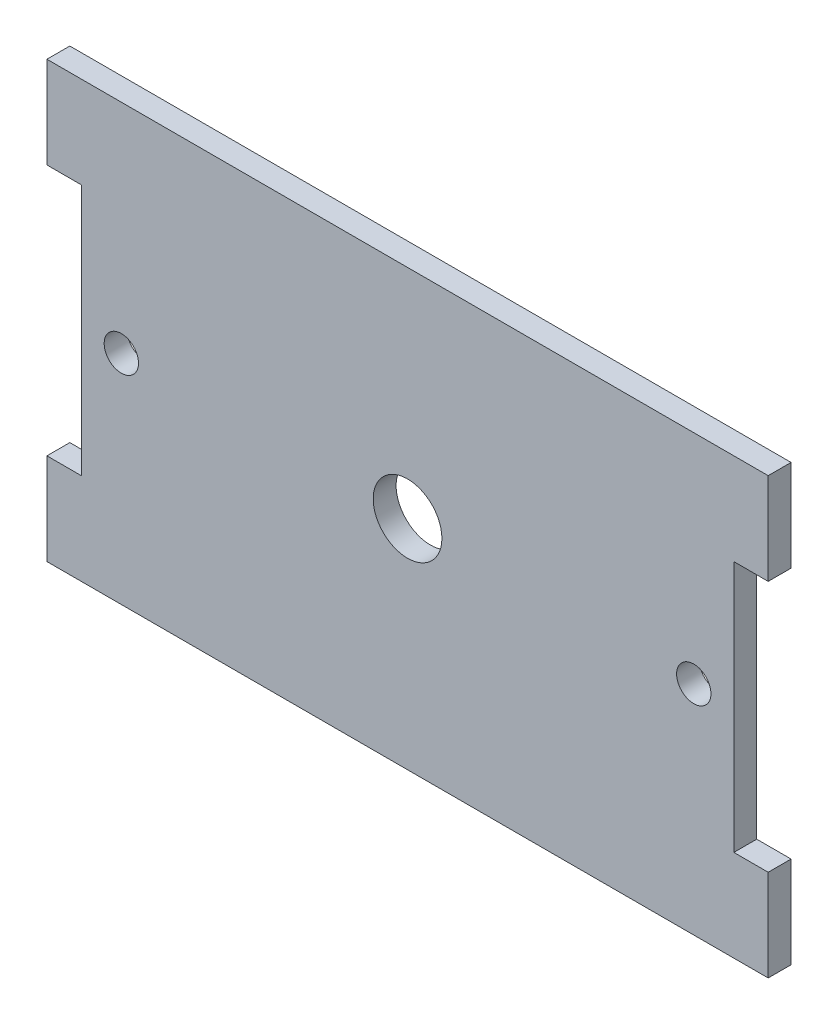
ISO-10303-21;
HEADER;
FILE_DESCRIPTION(('STEP AP214'),'2;1');
FILE_NAME('part.step','',(''),(''),'','','');
FILE_SCHEMA(('AUTOMOTIVE_DESIGN { 1 0 10303 214 1 1 1 1 }'));
ENDSEC;
DATA;
#1=APPLICATION_CONTEXT('core data for automotive mechanical design processes');
#2=APPLICATION_PROTOCOL_DEFINITION('international standard','automotive_design',2000,#1);
#3=PRODUCT_CONTEXT('',#1,'mechanical');
#4=PRODUCT('Part','Part','',(#3));
#5=PRODUCT_RELATED_PRODUCT_CATEGORY('part','',(#4));
#6=PRODUCT_DEFINITION_FORMATION('','',#4);
#7=PRODUCT_DEFINITION_CONTEXT('part definition',#1,'design');
#8=PRODUCT_DEFINITION('design','',#6,#7);
#9=PRODUCT_DEFINITION_SHAPE('','',#8);
#10=(LENGTH_UNIT() NAMED_UNIT(*) SI_UNIT(.MILLI.,.METRE.));
#11=(NAMED_UNIT(*) PLANE_ANGLE_UNIT() SI_UNIT($,.RADIAN.));
#12=(NAMED_UNIT(*) SI_UNIT($,.STERADIAN.) SOLID_ANGLE_UNIT());
#13=UNCERTAINTY_MEASURE_WITH_UNIT(LENGTH_MEASURE(1.E-05),#10,'distance_accuracy_value','');
#14=(GEOMETRIC_REPRESENTATION_CONTEXT(3) GLOBAL_UNCERTAINTY_ASSIGNED_CONTEXT((#13)) GLOBAL_UNIT_ASSIGNED_CONTEXT((#10,
#11,#12)) REPRESENTATION_CONTEXT('',''));
#15=CARTESIAN_POINT('',(0.,0.,0.));
#16=DIRECTION('',(0.,0.,1.));
#17=DIRECTION('',(1.,0.,0.));
#18=AXIS2_PLACEMENT_3D('',#15,#16,#17);
#19=CARTESIAN_POINT('',(0.,0.,2.));
#20=DIRECTION('',(0.,0.,1.));
#21=DIRECTION('',(1.,0.,0.));
#22=AXIS2_PLACEMENT_3D('',#19,#20,#21);
#23=PLANE('',#22);
#24=CARTESIAN_POINT('',(40.241142957594,-61.8725999131917,2.));
#25=DIRECTION('',(0.,0.,1.));
#26=DIRECTION('',(1.,0.,0.));
#27=AXIS2_PLACEMENT_3D('',#24,#25,#26);
#28=CIRCLE('',#27,1.5);
#29=CARTESIAN_POINT('',(41.7411429575941,-61.8725999131917,2.));
#30=VERTEX_POINT('',#29);
#31=EDGE_CURVE('E251',#30,#30,#28,.T.);
#32=ORIENTED_EDGE('',*,*,#31,.F.);
#33=EDGE_LOOP('',(#32));
#34=FACE_BOUND('',#33,.T.);
#35=DIRECTION('',(0.,-1.,0.));
#36=VECTOR('',#35,1.);
#37=CARTESIAN_POINT('',(-16.258857042406,-42.8725999131917,2.));
#38=LINE('',#37,#36);
#39=CARTESIAN_POINT('',(-16.258857042406,-42.8725999131917,2.));
#40=VERTEX_POINT('',#39);
#41=CARTESIAN_POINT('',(-16.258857042406,-50.8725999131917,2.));
#42=VERTEX_POINT('',#41);
#43=EDGE_CURVE('E179',#40,#42,#38,.T.);
#44=ORIENTED_EDGE('',*,*,#43,.T.);
#45=DIRECTION('',(1.,0.,0.));
#46=VECTOR('',#45,1.);
#47=CARTESIAN_POINT('',(-16.258857042406,-50.8725999131917,2.));
#48=LINE('',#47,#46);
#49=CARTESIAN_POINT('',(-13.258857042406,-50.8725999131917,2.));
#50=VERTEX_POINT('',#49);
#51=EDGE_CURVE('E102',#42,#50,#48,.T.);
#52=ORIENTED_EDGE('',*,*,#51,.T.);
#53=DIRECTION('',(0.,-1.,0.));
#54=VECTOR('',#53,1.);
#55=CARTESIAN_POINT('',(-13.258857042406,-72.8725999131917,2.));
#56=LINE('',#55,#54);
#57=CARTESIAN_POINT('',(-13.258857042406,-72.8725999131917,2.));
#58=VERTEX_POINT('',#57);
#59=EDGE_CURVE('E206',#50,#58,#56,.T.);
#60=ORIENTED_EDGE('',*,*,#59,.T.);
#61=DIRECTION('',(-1.,0.,0.));
#62=VECTOR('',#61,1.);
#63=CARTESIAN_POINT('',(-16.258857042406,-72.8725999131917,2.));
#64=LINE('',#63,#62);
#65=CARTESIAN_POINT('',(-16.258857042406,-72.8725999131917,2.));
#66=VERTEX_POINT('',#65);
#67=EDGE_CURVE('E222',#58,#66,#64,.T.);
#68=ORIENTED_EDGE('',*,*,#67,.T.);
#69=DIRECTION('',(0.,-1.,0.));
#70=VECTOR('',#69,1.);
#71=CARTESIAN_POINT('',(-16.258857042406,-80.8725999131917,2.));
#72=LINE('',#71,#70);
#73=CARTESIAN_POINT('',(-16.258857042406,-80.8725999131917,2.));
#74=VERTEX_POINT('',#73);
#75=EDGE_CURVE('E219',#66,#74,#72,.T.);
#76=ORIENTED_EDGE('',*,*,#75,.T.);
#77=DIRECTION('',(1.,0.,0.));
#78=VECTOR('',#77,1.);
#79=CARTESIAN_POINT('',(-13.258857042406,-80.8725999131917,2.));
#80=LINE('',#79,#78);
#81=CARTESIAN_POINT('',(46.741142957594,-80.8725999131917,2.));
#82=VERTEX_POINT('',#81);
#83=EDGE_CURVE('E221',#74,#82,#80,.T.);
#84=ORIENTED_EDGE('',*,*,#83,.T.);
#85=DIRECTION('',(0.,1.,0.));
#86=VECTOR('',#85,1.);
#87=CARTESIAN_POINT('',(46.741142957594,-80.8725999131917,2.));
#88=LINE('',#87,#86);
#89=CARTESIAN_POINT('',(46.741142957594,-72.8725999131917,2.));
#90=VERTEX_POINT('',#89);
#91=EDGE_CURVE('E224',#82,#90,#88,.T.);
#92=ORIENTED_EDGE('',*,*,#91,.T.);
#93=DIRECTION('',(-1.,0.,0.));
#94=VECTOR('',#93,1.);
#95=CARTESIAN_POINT('',(46.741142957594,-72.8725999131917,2.));
#96=LINE('',#95,#94);
#97=CARTESIAN_POINT('',(43.741142957594,-72.8725999131917,2.));
#98=VERTEX_POINT('',#97);
#99=EDGE_CURVE('E230',#90,#98,#96,.T.);
#100=ORIENTED_EDGE('',*,*,#99,.T.);
#101=DIRECTION('',(0.,1.,0.));
#102=VECTOR('',#101,1.);
#103=CARTESIAN_POINT('',(43.741142957594,-72.8725999131917,2.));
#104=LINE('',#103,#102);
#105=CARTESIAN_POINT('',(43.741142957594,-50.8725999131917,2.));
#106=VERTEX_POINT('',#105);
#107=EDGE_CURVE('E134',#98,#106,#104,.T.);
#108=ORIENTED_EDGE('',*,*,#107,.T.);
#109=DIRECTION('',(1.,0.,0.));
#110=VECTOR('',#109,1.);
#111=CARTESIAN_POINT('',(46.741142957594,-50.8725999131917,2.));
#112=LINE('',#111,#110);
#113=CARTESIAN_POINT('',(46.741142957594,-50.8725999131917,2.));
#114=VERTEX_POINT('',#113);
#115=EDGE_CURVE('E127',#106,#114,#112,.T.);
#116=ORIENTED_EDGE('',*,*,#115,.T.);
#117=DIRECTION('',(0.,1.,0.));
#118=VECTOR('',#117,1.);
#119=CARTESIAN_POINT('',(46.741142957594,-42.8725999131917,2.));
#120=LINE('',#119,#118);
#121=CARTESIAN_POINT('',(46.741142957594,-42.8725999131917,2.));
#122=VERTEX_POINT('',#121);
#123=EDGE_CURVE('E131',#114,#122,#120,.T.);
#124=ORIENTED_EDGE('',*,*,#123,.T.);
#125=DIRECTION('',(-1.,0.,0.));
#126=VECTOR('',#125,1.);
#127=CARTESIAN_POINT('',(43.741142957594,-42.8725999131917,2.));
#128=LINE('',#127,#126);
#129=EDGE_CURVE('E49',#122,#40,#128,.T.);
#130=ORIENTED_EDGE('',*,*,#129,.T.);
#131=EDGE_LOOP('',(#44,#52,#60,#68,#76,#84,#92,#100,#108,#116,#124,#130));
#132=FACE_BOUND('',#131,.T.);
#133=CARTESIAN_POINT('',(15.241142957594,-61.8725999131917,2.));
#134=DIRECTION('',(0.,0.,1.));
#135=DIRECTION('',(1.,0.,0.));
#136=AXIS2_PLACEMENT_3D('',#133,#134,#135);
#137=CIRCLE('',#136,3.);
#138=CARTESIAN_POINT('',(18.241142957594,-61.8725999131917,2.));
#139=VERTEX_POINT('',#138);
#140=EDGE_CURVE('E158',#139,#139,#137,.T.);
#141=ORIENTED_EDGE('',*,*,#140,.F.);
#142=EDGE_LOOP('',(#141));
#143=FACE_BOUND('',#142,.T.);
#144=CARTESIAN_POINT('',(-9.75885704240595,-61.8725999131917,2.));
#145=DIRECTION('',(0.,0.,1.));
#146=DIRECTION('',(-1.,0.,0.));
#147=AXIS2_PLACEMENT_3D('',#144,#145,#146);
#148=CIRCLE('',#147,1.5);
#149=CARTESIAN_POINT('',(-11.258857042406,-61.8725999131917,2.));
#150=VERTEX_POINT('',#149);
#151=EDGE_CURVE('E257',#150,#150,#148,.T.);
#152=ORIENTED_EDGE('',*,*,#151,.F.);
#153=EDGE_LOOP('',(#152));
#154=FACE_BOUND('',#153,.T.);
#155=ADVANCED_FACE('F32',(#34,#132,#143,#154),#23,.T.);
#156=CARTESIAN_POINT('',(0.,0.,0.));
#157=DIRECTION('',(0.,0.,1.));
#158=DIRECTION('',(1.,0.,0.));
#159=AXIS2_PLACEMENT_3D('',#156,#157,#158);
#160=PLANE('',#159);
#161=DIRECTION('',(0.,-1.,0.));
#162=VECTOR('',#161,1.);
#163=CARTESIAN_POINT('',(-16.258857042406,-42.8725999131917,0.));
#164=LINE('',#163,#162);
#165=CARTESIAN_POINT('',(-16.258857042406,-42.8725999131917,0.));
#166=VERTEX_POINT('',#165);
#167=CARTESIAN_POINT('',(-16.258857042406,-50.8725999131917,0.));
#168=VERTEX_POINT('',#167);
#169=EDGE_CURVE('E154',#166,#168,#164,.T.);
#170=ORIENTED_EDGE('',*,*,#169,.F.);
#171=DIRECTION('',(-1.,0.,0.));
#172=VECTOR('',#171,1.);
#173=CARTESIAN_POINT('',(-13.258857042406,-42.8725999131917,0.));
#174=LINE('',#173,#172);
#175=CARTESIAN_POINT('',(46.741142957594,-42.8725999131917,0.));
#176=VERTEX_POINT('',#175);
#177=EDGE_CURVE('E90',#176,#166,#174,.T.);
#178=ORIENTED_EDGE('',*,*,#177,.F.);
#179=DIRECTION('',(0.,1.,0.));
#180=VECTOR('',#179,1.);
#181=CARTESIAN_POINT('',(46.741142957594,-42.8725999131917,0.));
#182=LINE('',#181,#180);
#183=CARTESIAN_POINT('',(46.741142957594,-50.8725999131917,0.));
#184=VERTEX_POINT('',#183);
#185=EDGE_CURVE('E176',#184,#176,#182,.T.);
#186=ORIENTED_EDGE('',*,*,#185,.F.);
#187=DIRECTION('',(1.,0.,0.));
#188=VECTOR('',#187,1.);
#189=CARTESIAN_POINT('',(46.741142957594,-50.8725999131917,0.));
#190=LINE('',#189,#188);
#191=CARTESIAN_POINT('',(43.741142957594,-50.8725999131917,0.));
#192=VERTEX_POINT('',#191);
#193=EDGE_CURVE('E143',#192,#184,#190,.T.);
#194=ORIENTED_EDGE('',*,*,#193,.F.);
#195=DIRECTION('',(0.,1.,0.));
#196=VECTOR('',#195,1.);
#197=CARTESIAN_POINT('',(43.741142957594,-72.8725999131917,0.));
#198=LINE('',#197,#196);
#199=CARTESIAN_POINT('',(43.741142957594,-72.8725999131917,0.));
#200=VERTEX_POINT('',#199);
#201=EDGE_CURVE('E173',#200,#192,#198,.T.);
#202=ORIENTED_EDGE('',*,*,#201,.F.);
#203=DIRECTION('',(-1.,0.,0.));
#204=VECTOR('',#203,1.);
#205=CARTESIAN_POINT('',(46.741142957594,-72.8725999131917,0.));
#206=LINE('',#205,#204);
#207=CARTESIAN_POINT('',(46.741142957594,-72.8725999131917,0.));
#208=VERTEX_POINT('',#207);
#209=EDGE_CURVE('E171',#208,#200,#206,.T.);
#210=ORIENTED_EDGE('',*,*,#209,.F.);
#211=DIRECTION('',(0.,1.,0.));
#212=VECTOR('',#211,1.);
#213=CARTESIAN_POINT('',(46.741142957594,-80.8725999131917,0.));
#214=LINE('',#213,#212);
#215=CARTESIAN_POINT('',(46.741142957594,-80.8725999131917,0.));
#216=VERTEX_POINT('',#215);
#217=EDGE_CURVE('E169',#216,#208,#214,.T.);
#218=ORIENTED_EDGE('',*,*,#217,.F.);
#219=DIRECTION('',(1.,0.,0.));
#220=VECTOR('',#219,1.);
#221=CARTESIAN_POINT('',(43.741142957594,-80.8725999131917,0.));
#222=LINE('',#221,#220);
#223=CARTESIAN_POINT('',(-16.258857042406,-80.8725999131917,0.));
#224=VERTEX_POINT('',#223);
#225=EDGE_CURVE('E167',#224,#216,#222,.T.);
#226=ORIENTED_EDGE('',*,*,#225,.F.);
#227=DIRECTION('',(0.,-1.,0.));
#228=VECTOR('',#227,1.);
#229=CARTESIAN_POINT('',(-16.258857042406,-80.8725999131917,0.));
#230=LINE('',#229,#228);
#231=CARTESIAN_POINT('',(-16.258857042406,-72.8725999131917,0.));
#232=VERTEX_POINT('',#231);
#233=EDGE_CURVE('E164',#232,#224,#230,.T.);
#234=ORIENTED_EDGE('',*,*,#233,.F.);
#235=DIRECTION('',(-1.,0.,0.));
#236=VECTOR('',#235,1.);
#237=CARTESIAN_POINT('',(-16.258857042406,-72.8725999131917,0.));
#238=LINE('',#237,#236);
#239=CARTESIAN_POINT('',(-13.258857042406,-72.8725999131917,0.));
#240=VERTEX_POINT('',#239);
#241=EDGE_CURVE('E162',#240,#232,#238,.T.);
#242=ORIENTED_EDGE('',*,*,#241,.F.);
#243=DIRECTION('',(0.,-1.,0.));
#244=VECTOR('',#243,1.);
#245=CARTESIAN_POINT('',(-13.258857042406,-72.8725999131917,0.));
#246=LINE('',#245,#244);
#247=CARTESIAN_POINT('',(-13.258857042406,-50.8725999131917,0.));
#248=VERTEX_POINT('',#247);
#249=EDGE_CURVE('E160',#248,#240,#246,.T.);
#250=ORIENTED_EDGE('',*,*,#249,.F.);
#251=DIRECTION('',(1.,0.,0.));
#252=VECTOR('',#251,1.);
#253=CARTESIAN_POINT('',(-16.258857042406,-50.8725999131917,0.));
#254=LINE('',#253,#252);
#255=EDGE_CURVE('E157',#168,#248,#254,.T.);
#256=ORIENTED_EDGE('',*,*,#255,.F.);
#257=EDGE_LOOP('',(#170,#178,#186,#194,#202,#210,#218,#226,#234,#242,#250,#256));
#258=FACE_BOUND('',#257,.T.);
#259=CARTESIAN_POINT('',(15.241142957594,-61.8725999131917,0.));
#260=DIRECTION('',(0.,0.,1.));
#261=DIRECTION('',(1.,0.,0.));
#262=AXIS2_PLACEMENT_3D('',#259,#260,#261);
#263=CIRCLE('',#262,3.);
#264=CARTESIAN_POINT('',(18.241142957594,-61.8725999131917,0.));
#265=VERTEX_POINT('',#264);
#266=EDGE_CURVE('E248',#265,#265,#263,.T.);
#267=ORIENTED_EDGE('',*,*,#266,.T.);
#268=EDGE_LOOP('',(#267));
#269=FACE_BOUND('',#268,.T.);
#270=CARTESIAN_POINT('',(40.241142957594,-61.8725999131917,0.));
#271=DIRECTION('',(0.,0.,1.));
#272=DIRECTION('',(1.,0.,0.));
#273=AXIS2_PLACEMENT_3D('',#270,#271,#272);
#274=CIRCLE('',#273,1.5);
#275=CARTESIAN_POINT('',(41.7411429575941,-61.8725999131917,0.));
#276=VERTEX_POINT('',#275);
#277=EDGE_CURVE('E254',#276,#276,#274,.T.);
#278=ORIENTED_EDGE('',*,*,#277,.T.);
#279=EDGE_LOOP('',(#278));
#280=FACE_BOUND('',#279,.T.);
#281=CARTESIAN_POINT('',(-9.75885704240595,-61.8725999131917,0.));
#282=DIRECTION('',(0.,0.,1.));
#283=DIRECTION('',(-1.,0.,0.));
#284=AXIS2_PLACEMENT_3D('',#281,#282,#283);
#285=CIRCLE('',#284,1.5);
#286=CARTESIAN_POINT('',(-11.258857042406,-61.8725999131917,0.));
#287=VERTEX_POINT('',#286);
#288=EDGE_CURVE('E260',#287,#287,#285,.T.);
#289=ORIENTED_EDGE('',*,*,#288,.T.);
#290=EDGE_LOOP('',(#289));
#291=FACE_BOUND('',#290,.T.);
#292=ADVANCED_FACE('F208',(#258,#269,#280,#291),#160,.F.);
#293=CARTESIAN_POINT('',(-16.258857042406,-42.8725999131917,2.));
#294=DIRECTION('',(1.,0.,0.));
#295=DIRECTION('',(0.,0.,-1.));
#296=AXIS2_PLACEMENT_3D('',#293,#294,#295);
#297=PLANE('',#296);
#298=ORIENTED_EDGE('',*,*,#169,.T.);
#299=DIRECTION('',(0.,0.,-1.));
#300=VECTOR('',#299,1.);
#301=CARTESIAN_POINT('',(-16.258857042406,-50.8725999131917,2.));
#302=LINE('',#301,#300);
#303=EDGE_CURVE('E11',#42,#168,#302,.T.);
#304=ORIENTED_EDGE('',*,*,#303,.F.);
#305=ORIENTED_EDGE('',*,*,#43,.F.);
#306=DIRECTION('',(0.,0.,-1.));
#307=VECTOR('',#306,1.);
#308=CARTESIAN_POINT('',(-16.258857042406,-42.8725999131917,2.));
#309=LINE('',#308,#307);
#310=EDGE_CURVE('E150',#40,#166,#309,.T.);
#311=ORIENTED_EDGE('',*,*,#310,.T.);
#312=EDGE_LOOP('',(#298,#304,#305,#311));
#313=FACE_BOUND('',#312,.T.);
#314=ADVANCED_FACE('F34',(#313),#297,.F.);
#315=CARTESIAN_POINT('',(-16.258857042406,-50.8725999131917,2.));
#316=DIRECTION('',(0.,1.,0.));
#317=DIRECTION('',(0.,0.,1.));
#318=AXIS2_PLACEMENT_3D('',#315,#316,#317);
#319=PLANE('',#318);
#320=ORIENTED_EDGE('',*,*,#255,.T.);
#321=DIRECTION('',(0.,0.,-1.));
#322=VECTOR('',#321,1.);
#323=CARTESIAN_POINT('',(-13.258857042406,-50.8725999131917,2.));
#324=LINE('',#323,#322);
#325=EDGE_CURVE('E41',#50,#248,#324,.T.);
#326=ORIENTED_EDGE('',*,*,#325,.F.);
#327=ORIENTED_EDGE('',*,*,#51,.F.);
#328=ORIENTED_EDGE('',*,*,#303,.T.);
#329=EDGE_LOOP('',(#320,#326,#327,#328));
#330=FACE_BOUND('',#329,.T.);
#331=ADVANCED_FACE('F304',(#330),#319,.F.);
#332=CARTESIAN_POINT('',(-13.258857042406,-72.8725999131917,2.));
#333=DIRECTION('',(1.,0.,0.));
#334=DIRECTION('',(0.,1.,0.));
#335=AXIS2_PLACEMENT_3D('',#332,#333,#334);
#336=PLANE('',#335);
#337=ORIENTED_EDGE('',*,*,#249,.T.);
#338=DIRECTION('',(0.,0.,-1.));
#339=VECTOR('',#338,1.);
#340=CARTESIAN_POINT('',(-13.258857042406,-72.8725999131917,2.));
#341=LINE('',#340,#339);
#342=EDGE_CURVE('E198',#58,#240,#341,.T.);
#343=ORIENTED_EDGE('',*,*,#342,.F.);
#344=ORIENTED_EDGE('',*,*,#59,.F.);
#345=ORIENTED_EDGE('',*,*,#325,.T.);
#346=EDGE_LOOP('',(#337,#343,#344,#345));
#347=FACE_BOUND('',#346,.T.);
#348=ADVANCED_FACE('F204',(#347),#336,.F.);
#349=CARTESIAN_POINT('',(-16.258857042406,-72.8725999131917,2.));
#350=DIRECTION('',(0.,-1.,0.));
#351=DIRECTION('',(0.,0.,-1.));
#352=AXIS2_PLACEMENT_3D('',#349,#350,#351);
#353=PLANE('',#352);
#354=ORIENTED_EDGE('',*,*,#241,.T.);
#355=DIRECTION('',(0.,0.,-1.));
#356=VECTOR('',#355,1.);
#357=CARTESIAN_POINT('',(-16.258857042406,-72.8725999131917,2.));
#358=LINE('',#357,#356);
#359=EDGE_CURVE('E195',#66,#232,#358,.T.);
#360=ORIENTED_EDGE('',*,*,#359,.F.);
#361=ORIENTED_EDGE('',*,*,#67,.F.);
#362=ORIENTED_EDGE('',*,*,#342,.T.);
#363=EDGE_LOOP('',(#354,#360,#361,#362));
#364=FACE_BOUND('',#363,.T.);
#365=ADVANCED_FACE('F213',(#364),#353,.F.);
#366=CARTESIAN_POINT('',(-16.258857042406,-80.8725999131917,2.));
#367=DIRECTION('',(1.,0.,0.));
#368=DIRECTION('',(0.,0.,-1.));
#369=AXIS2_PLACEMENT_3D('',#366,#367,#368);
#370=PLANE('',#369);
#371=ORIENTED_EDGE('',*,*,#233,.T.);
#372=DIRECTION('',(0.,0.,-1.));
#373=VECTOR('',#372,1.);
#374=CARTESIAN_POINT('',(-16.258857042406,-80.8725999131917,2.));
#375=LINE('',#374,#373);
#376=EDGE_CURVE('E192',#74,#224,#375,.T.);
#377=ORIENTED_EDGE('',*,*,#376,.F.);
#378=ORIENTED_EDGE('',*,*,#75,.F.);
#379=ORIENTED_EDGE('',*,*,#359,.T.);
#380=EDGE_LOOP('',(#371,#377,#378,#379));
#381=FACE_BOUND('',#380,.T.);
#382=ADVANCED_FACE('F217',(#381),#370,.F.);
#383=CARTESIAN_POINT('',(43.741142957594,-80.8725999131917,2.));
#384=DIRECTION('',(0.,1.,0.));
#385=DIRECTION('',(0.,0.,1.));
#386=AXIS2_PLACEMENT_3D('',#383,#384,#385);
#387=PLANE('',#386);
#388=ORIENTED_EDGE('',*,*,#225,.T.);
#389=DIRECTION('',(0.,0.,-1.));
#390=VECTOR('',#389,1.);
#391=CARTESIAN_POINT('',(46.741142957594,-80.8725999131917,2.));
#392=LINE('',#391,#390);
#393=EDGE_CURVE('E189',#82,#216,#392,.T.);
#394=ORIENTED_EDGE('',*,*,#393,.F.);
#395=ORIENTED_EDGE('',*,*,#83,.F.);
#396=ORIENTED_EDGE('',*,*,#376,.T.);
#397=EDGE_LOOP('',(#388,#394,#395,#396));
#398=FACE_BOUND('',#397,.T.);
#399=ADVANCED_FACE('F294',(#398),#387,.F.);
#400=CARTESIAN_POINT('',(46.741142957594,-80.8725999131917,2.));
#401=DIRECTION('',(-1.,0.,0.));
#402=DIRECTION('',(0.,0.,1.));
#403=AXIS2_PLACEMENT_3D('',#400,#401,#402);
#404=PLANE('',#403);
#405=ORIENTED_EDGE('',*,*,#217,.T.);
#406=DIRECTION('',(0.,0.,-1.));
#407=VECTOR('',#406,1.);
#408=CARTESIAN_POINT('',(46.741142957594,-72.8725999131917,2.));
#409=LINE('',#408,#407);
#410=EDGE_CURVE('E186',#90,#208,#409,.T.);
#411=ORIENTED_EDGE('',*,*,#410,.F.);
#412=ORIENTED_EDGE('',*,*,#91,.F.);
#413=ORIENTED_EDGE('',*,*,#393,.T.);
#414=EDGE_LOOP('',(#405,#411,#412,#413));
#415=FACE_BOUND('',#414,.T.);
#416=ADVANCED_FACE('F291',(#415),#404,.F.);
#417=CARTESIAN_POINT('',(46.741142957594,-72.8725999131917,2.));
#418=DIRECTION('',(0.,-1.,0.));
#419=DIRECTION('',(0.,0.,-1.));
#420=AXIS2_PLACEMENT_3D('',#417,#418,#419);
#421=PLANE('',#420);
#422=ORIENTED_EDGE('',*,*,#209,.T.);
#423=DIRECTION('',(0.,0.,-1.));
#424=VECTOR('',#423,1.);
#425=CARTESIAN_POINT('',(43.741142957594,-72.8725999131917,2.));
#426=LINE('',#425,#424);
#427=EDGE_CURVE('E183',#98,#200,#426,.T.);
#428=ORIENTED_EDGE('',*,*,#427,.F.);
#429=ORIENTED_EDGE('',*,*,#99,.F.);
#430=ORIENTED_EDGE('',*,*,#410,.T.);
#431=EDGE_LOOP('',(#422,#428,#429,#430));
#432=FACE_BOUND('',#431,.T.);
#433=ADVANCED_FACE('F236',(#432),#421,.F.);
#434=CARTESIAN_POINT('',(43.741142957594,-72.8725999131917,2.));
#435=DIRECTION('',(-1.,0.,0.));
#436=DIRECTION('',(0.,0.,1.));
#437=AXIS2_PLACEMENT_3D('',#434,#435,#436);
#438=PLANE('',#437);
#439=ORIENTED_EDGE('',*,*,#201,.T.);
#440=DIRECTION('',(0.,0.,-1.));
#441=VECTOR('',#440,1.);
#442=CARTESIAN_POINT('',(43.741142957594,-50.8725999131917,2.));
#443=LINE('',#442,#441);
#444=EDGE_CURVE('E145',#106,#192,#443,.T.);
#445=ORIENTED_EDGE('',*,*,#444,.F.);
#446=ORIENTED_EDGE('',*,*,#107,.F.);
#447=ORIENTED_EDGE('',*,*,#427,.T.);
#448=EDGE_LOOP('',(#439,#445,#446,#447));
#449=FACE_BOUND('',#448,.T.);
#450=ADVANCED_FACE('F240',(#449),#438,.F.);
#451=CARTESIAN_POINT('',(46.741142957594,-50.8725999131917,2.));
#452=DIRECTION('',(0.,1.,0.));
#453=DIRECTION('',(0.,0.,1.));
#454=AXIS2_PLACEMENT_3D('',#451,#452,#453);
#455=PLANE('',#454);
#456=ORIENTED_EDGE('',*,*,#193,.T.);
#457=DIRECTION('',(0.,0.,-1.));
#458=VECTOR('',#457,1.);
#459=CARTESIAN_POINT('',(46.741142957594,-50.8725999131917,2.));
#460=LINE('',#459,#458);
#461=EDGE_CURVE('E140',#114,#184,#460,.T.);
#462=ORIENTED_EDGE('',*,*,#461,.F.);
#463=ORIENTED_EDGE('',*,*,#115,.F.);
#464=ORIENTED_EDGE('',*,*,#444,.T.);
#465=EDGE_LOOP('',(#456,#462,#463,#464));
#466=FACE_BOUND('',#465,.T.);
#467=ADVANCED_FACE('F141',(#466),#455,.F.);
#468=CARTESIAN_POINT('',(46.741142957594,-42.8725999131917,2.));
#469=DIRECTION('',(-1.,0.,0.));
#470=DIRECTION('',(0.,0.,1.));
#471=AXIS2_PLACEMENT_3D('',#468,#469,#470);
#472=PLANE('',#471);
#473=ORIENTED_EDGE('',*,*,#185,.T.);
#474=DIRECTION('',(0.,0.,-1.));
#475=VECTOR('',#474,1.);
#476=CARTESIAN_POINT('',(46.741142957594,-42.8725999131917,2.));
#477=LINE('',#476,#475);
#478=EDGE_CURVE('E146',#122,#176,#477,.T.);
#479=ORIENTED_EDGE('',*,*,#478,.F.);
#480=ORIENTED_EDGE('',*,*,#123,.F.);
#481=ORIENTED_EDGE('',*,*,#461,.T.);
#482=EDGE_LOOP('',(#473,#479,#480,#481));
#483=FACE_BOUND('',#482,.T.);
#484=ADVANCED_FACE('F148',(#483),#472,.F.);
#485=CARTESIAN_POINT('',(-13.258857042406,-42.8725999131917,2.));
#486=DIRECTION('',(0.,-1.,0.));
#487=DIRECTION('',(0.,0.,-1.));
#488=AXIS2_PLACEMENT_3D('',#485,#486,#487);
#489=PLANE('',#488);
#490=ORIENTED_EDGE('',*,*,#177,.T.);
#491=ORIENTED_EDGE('',*,*,#310,.F.);
#492=ORIENTED_EDGE('',*,*,#129,.F.);
#493=ORIENTED_EDGE('',*,*,#478,.T.);
#494=EDGE_LOOP('',(#490,#491,#492,#493));
#495=FACE_BOUND('',#494,.T.);
#496=ADVANCED_FACE('F241',(#495),#489,.F.);
#497=CARTESIAN_POINT('',(15.241142957594,-61.8725999131917,2.));
#498=DIRECTION('',(0.,0.,-1.));
#499=DIRECTION('',(-1.,0.,0.));
#500=AXIS2_PLACEMENT_3D('',#497,#498,#499);
#501=CYLINDRICAL_SURFACE('',#500,3.);
#502=ORIENTED_EDGE('',*,*,#140,.T.);
#503=EDGE_LOOP('',(#502));
#504=FACE_BOUND('',#503,.T.);
#505=ORIENTED_EDGE('',*,*,#266,.F.);
#506=EDGE_LOOP('',(#505));
#507=FACE_BOUND('',#506,.T.);
#508=ADVANCED_FACE('F278',(#504,#507),#501,.F.);
#509=CARTESIAN_POINT('',(40.241142957594,-61.8725999131917,2.));
#510=DIRECTION('',(0.,0.,-1.));
#511=DIRECTION('',(-1.,0.,0.));
#512=AXIS2_PLACEMENT_3D('',#509,#510,#511);
#513=CYLINDRICAL_SURFACE('',#512,1.5);
#514=ORIENTED_EDGE('',*,*,#31,.T.);
#515=EDGE_LOOP('',(#514));
#516=FACE_BOUND('',#515,.T.);
#517=ORIENTED_EDGE('',*,*,#277,.F.);
#518=EDGE_LOOP('',(#517));
#519=FACE_BOUND('',#518,.T.);
#520=ADVANCED_FACE('F400',(#516,#519),#513,.F.);
#521=CARTESIAN_POINT('',(-9.75885704240595,-61.8725999131917,2.));
#522=DIRECTION('',(0.,0.,-1.));
#523=DIRECTION('',(-1.,0.,0.));
#524=AXIS2_PLACEMENT_3D('',#521,#522,#523);
#525=CYLINDRICAL_SURFACE('',#524,1.5);
#526=ORIENTED_EDGE('',*,*,#151,.T.);
#527=EDGE_LOOP('',(#526));
#528=FACE_BOUND('',#527,.T.);
#529=ORIENTED_EDGE('',*,*,#288,.F.);
#530=EDGE_LOOP('',(#529));
#531=FACE_BOUND('',#530,.T.);
#532=ADVANCED_FACE('F266',(#528,#531),#525,.F.);
#533=CLOSED_SHELL('',(#155,#292,#314,#331,#348,#365,#382,#399,#416,#433,#450,#467,#484,#496,
#508,#520,#532));
#534=MANIFOLD_SOLID_BREP('B2',#533);
#535=ADVANCED_BREP_SHAPE_REPRESENTATION('',(#18,#534),#14);
#536=SHAPE_DEFINITION_REPRESENTATION(#9,#535);
ENDSEC;
END-ISO-10303-21;
